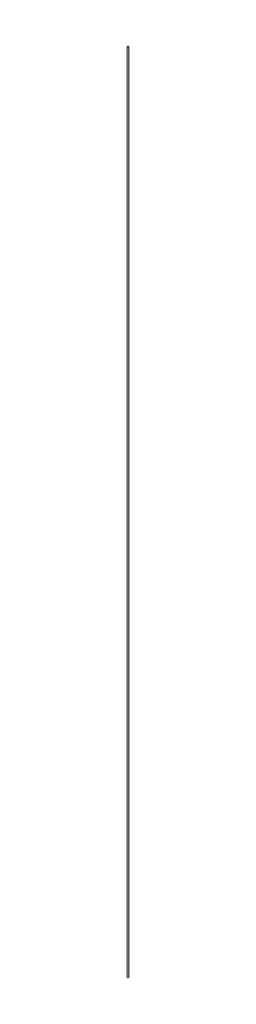
ISO-10303-21;
HEADER;
FILE_DESCRIPTION(('STEP AP214'),'2;1');
FILE_NAME('part.step','',(''),(''),'','','');
FILE_SCHEMA(('AUTOMOTIVE_DESIGN { 1 0 10303 214 1 1 1 1 }'));
ENDSEC;
DATA;
#1=APPLICATION_CONTEXT('core data for automotive mechanical design processes');
#2=APPLICATION_PROTOCOL_DEFINITION('international standard','automotive_design',2000,#1);
#3=PRODUCT_CONTEXT('',#1,'mechanical');
#4=PRODUCT('Part','Part','',(#3));
#5=PRODUCT_RELATED_PRODUCT_CATEGORY('part','',(#4));
#6=PRODUCT_DEFINITION_FORMATION('','',#4);
#7=PRODUCT_DEFINITION_CONTEXT('part definition',#1,'design');
#8=PRODUCT_DEFINITION('design','',#6,#7);
#9=PRODUCT_DEFINITION_SHAPE('','',#8);
#10=(LENGTH_UNIT() NAMED_UNIT(*) SI_UNIT(.MILLI.,.METRE.));
#11=(NAMED_UNIT(*) PLANE_ANGLE_UNIT() SI_UNIT($,.RADIAN.));
#12=(NAMED_UNIT(*) SI_UNIT($,.STERADIAN.) SOLID_ANGLE_UNIT());
#13=UNCERTAINTY_MEASURE_WITH_UNIT(LENGTH_MEASURE(1.E-05),#10,'distance_accuracy_value','');
#14=(GEOMETRIC_REPRESENTATION_CONTEXT(3) GLOBAL_UNCERTAINTY_ASSIGNED_CONTEXT((#13)) GLOBAL_UNIT_ASSIGNED_CONTEXT((#10,
#11,#12)) REPRESENTATION_CONTEXT('',''));
#15=CARTESIAN_POINT('',(0.,0.,0.));
#16=DIRECTION('',(0.,0.,1.));
#17=DIRECTION('',(1.,0.,0.));
#18=AXIS2_PLACEMENT_3D('',#15,#16,#17);
#19=CARTESIAN_POINT('',(0.,0.,0.));
#20=DIRECTION('',(0.,1.,0.));
#21=DIRECTION('',(0.,0.,1.));
#22=AXIS2_PLACEMENT_3D('',#19,#20,#21);
#23=PLANE('',#22);
#24=CARTESIAN_POINT('',(0.,0.,0.));
#25=DIRECTION('',(0.,1.,0.));
#26=DIRECTION('',(0.,0.,1.));
#27=AXIS2_PLACEMENT_3D('',#24,#25,#26);
#28=CIRCLE('',#27,6.35);
#29=CARTESIAN_POINT('',(0.,0.,6.35));
#30=VERTEX_POINT('',#29);
#31=EDGE_CURVE('E46',#30,#30,#28,.T.);
#32=ORIENTED_EDGE('',*,*,#31,.F.);
#33=EDGE_LOOP('',(#32));
#34=FACE_BOUND('',#33,.T.);
#35=ADVANCED_FACE('F40',(#34),#23,.F.);
#36=CARTESIAN_POINT('',(0.,8812.784,0.));
#37=DIRECTION('',(0.,1.,0.));
#38=DIRECTION('',(0.,0.,1.));
#39=AXIS2_PLACEMENT_3D('',#36,#37,#38);
#40=PLANE('',#39);
#41=CARTESIAN_POINT('',(0.,8812.784,0.));
#42=DIRECTION('',(0.,1.,0.));
#43=DIRECTION('',(0.,0.,1.));
#44=AXIS2_PLACEMENT_3D('',#41,#42,#43);
#45=CIRCLE('',#44,6.35);
#46=CARTESIAN_POINT('',(0.,8812.784,6.35));
#47=VERTEX_POINT('',#46);
#48=EDGE_CURVE('E11',#47,#47,#45,.T.);
#49=ORIENTED_EDGE('',*,*,#48,.T.);
#50=EDGE_LOOP('',(#49));
#51=FACE_BOUND('',#50,.T.);
#52=ADVANCED_FACE('F55',(#51),#40,.T.);
#53=CARTESIAN_POINT('',(0.,0.,0.));
#54=DIRECTION('',(0.,1.,0.));
#55=DIRECTION('',(0.,0.,1.));
#56=AXIS2_PLACEMENT_3D('',#53,#54,#55);
#57=CYLINDRICAL_SURFACE('',#56,6.35);
#58=ORIENTED_EDGE('',*,*,#48,.F.);
#59=EDGE_LOOP('',(#58));
#60=FACE_BOUND('',#59,.T.);
#61=ORIENTED_EDGE('',*,*,#31,.T.);
#62=EDGE_LOOP('',(#61));
#63=FACE_BOUND('',#62,.T.);
#64=ADVANCED_FACE('F52',(#60,#63),#57,.T.);
#65=CLOSED_SHELL('',(#35,#52,#64));
#66=MANIFOLD_SOLID_BREP('B2',#65);
#67=ADVANCED_BREP_SHAPE_REPRESENTATION('',(#18,#66),#14);
#68=SHAPE_DEFINITION_REPRESENTATION(#9,#67);
ENDSEC;
END-ISO-10303-21;
